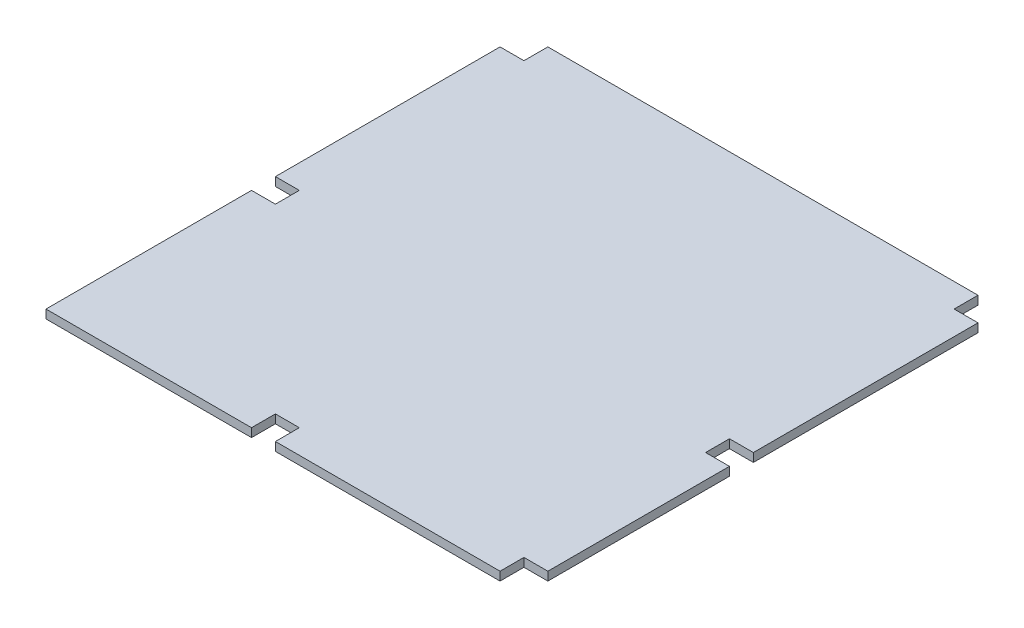
ISO-10303-21;
HEADER;
FILE_DESCRIPTION(('STEP AP214'),'2;1');
FILE_NAME('part.step','',(''),(''),'','','');
FILE_SCHEMA(('AUTOMOTIVE_DESIGN { 1 0 10303 214 1 1 1 1 }'));
ENDSEC;
DATA;
#1=APPLICATION_CONTEXT('core data for automotive mechanical design processes');
#2=APPLICATION_PROTOCOL_DEFINITION('international standard','automotive_design',2000,#1);
#3=PRODUCT_CONTEXT('',#1,'mechanical');
#4=PRODUCT('Part','Part','',(#3));
#5=PRODUCT_RELATED_PRODUCT_CATEGORY('part','',(#4));
#6=PRODUCT_DEFINITION_FORMATION('','',#4);
#7=PRODUCT_DEFINITION_CONTEXT('part definition',#1,'design');
#8=PRODUCT_DEFINITION('design','',#6,#7);
#9=PRODUCT_DEFINITION_SHAPE('','',#8);
#10=(LENGTH_UNIT() NAMED_UNIT(*) SI_UNIT(.MILLI.,.METRE.));
#11=(NAMED_UNIT(*) PLANE_ANGLE_UNIT() SI_UNIT($,.RADIAN.));
#12=(NAMED_UNIT(*) SI_UNIT($,.STERADIAN.) SOLID_ANGLE_UNIT());
#13=UNCERTAINTY_MEASURE_WITH_UNIT(LENGTH_MEASURE(1.E-05),#10,'distance_accuracy_value','');
#14=(GEOMETRIC_REPRESENTATION_CONTEXT(3) GLOBAL_UNCERTAINTY_ASSIGNED_CONTEXT((#13)) GLOBAL_UNIT_ASSIGNED_CONTEXT((#10,
#11,#12)) REPRESENTATION_CONTEXT('',''));
#15=CARTESIAN_POINT('',(0.,0.,0.));
#16=DIRECTION('',(0.,0.,1.));
#17=DIRECTION('',(1.,0.,0.));
#18=AXIS2_PLACEMENT_3D('',#15,#16,#17);
#19=CARTESIAN_POINT('',(0.,18.,180.));
#20=DIRECTION('',(-1.,0.,0.));
#21=DIRECTION('',(0.,0.,1.));
#22=AXIS2_PLACEMENT_3D('',#19,#20,#21);
#23=PLANE('',#22);
#24=DIRECTION('',(0.,0.,-1.));
#25=VECTOR('',#24,1.);
#26=CARTESIAN_POINT('',(0.,0.,180.));
#27=LINE('',#26,#25);
#28=CARTESIAN_POINT('',(0.,0.,180.));
#29=VERTEX_POINT('',#28);
#30=CARTESIAN_POINT('',(0.,0.,-250.));
#31=VERTEX_POINT('',#30);
#32=EDGE_CURVE('E215',#29,#31,#27,.T.);
#33=ORIENTED_EDGE('',*,*,#32,.F.);
#34=DIRECTION('',(0.,-1.,0.));
#35=VECTOR('',#34,1.);
#36=CARTESIAN_POINT('',(0.,18.,180.));
#37=LINE('',#36,#35);
#38=CARTESIAN_POINT('',(0.,18.,180.));
#39=VERTEX_POINT('',#38);
#40=EDGE_CURVE('E11',#39,#29,#37,.T.);
#41=ORIENTED_EDGE('',*,*,#40,.F.);
#42=DIRECTION('',(0.,0.,-1.));
#43=VECTOR('',#42,1.);
#44=CARTESIAN_POINT('',(0.,18.,180.));
#45=LINE('',#44,#43);
#46=CARTESIAN_POINT('',(0.,18.,-250.));
#47=VERTEX_POINT('',#46);
#48=EDGE_CURVE('E271',#39,#47,#45,.T.);
#49=ORIENTED_EDGE('',*,*,#48,.T.);
#50=DIRECTION('',(0.,-1.,0.));
#51=VECTOR('',#50,1.);
#52=CARTESIAN_POINT('',(0.,18.,-250.));
#53=LINE('',#52,#51);
#54=EDGE_CURVE('E35',#47,#31,#53,.T.);
#55=ORIENTED_EDGE('',*,*,#54,.T.);
#56=EDGE_LOOP('',(#33,#41,#49,#55));
#57=FACE_BOUND('',#56,.T.);
#58=ADVANCED_FACE('F32',(#57),#23,.T.);
#59=CARTESIAN_POINT('',(0.,18.,180.));
#60=DIRECTION('',(0.,0.,-1.));
#61=DIRECTION('',(-1.,0.,0.));
#62=AXIS2_PLACEMENT_3D('',#59,#60,#61);
#63=PLANE('',#62);
#64=DIRECTION('',(1.,0.,0.));
#65=VECTOR('',#64,1.);
#66=CARTESIAN_POINT('',(0.,0.,180.));
#67=LINE('',#66,#65);
#68=CARTESIAN_POINT('',(430.,0.,180.));
#69=VERTEX_POINT('',#68);
#70=EDGE_CURVE('E119',#29,#69,#67,.T.);
#71=ORIENTED_EDGE('',*,*,#70,.T.);
#72=DIRECTION('',(0.,-1.,0.));
#73=VECTOR('',#72,1.);
#74=CARTESIAN_POINT('',(430.,18.,180.));
#75=LINE('',#74,#73);
#76=CARTESIAN_POINT('',(430.,18.,180.));
#77=VERTEX_POINT('',#76);
#78=EDGE_CURVE('E41',#77,#69,#75,.T.);
#79=ORIENTED_EDGE('',*,*,#78,.F.);
#80=DIRECTION('',(1.,0.,0.));
#81=VECTOR('',#80,1.);
#82=CARTESIAN_POINT('',(0.,18.,180.));
#83=LINE('',#82,#81);
#84=EDGE_CURVE('E193',#39,#77,#83,.T.);
#85=ORIENTED_EDGE('',*,*,#84,.F.);
#86=ORIENTED_EDGE('',*,*,#40,.T.);
#87=EDGE_LOOP('',(#71,#79,#85,#86));
#88=FACE_BOUND('',#87,.T.);
#89=ADVANCED_FACE('F438',(#88),#63,.F.);
#90=CARTESIAN_POINT('',(430.,18.,180.));
#91=DIRECTION('',(-1.,0.,0.));
#92=DIRECTION('',(0.,0.,1.));
#93=AXIS2_PLACEMENT_3D('',#90,#91,#92);
#94=PLANE('',#93);
#95=DIRECTION('',(0.,0.,-1.));
#96=VECTOR('',#95,1.);
#97=CARTESIAN_POINT('',(430.,0.,180.));
#98=LINE('',#97,#96);
#99=CARTESIAN_POINT('',(430.,0.,130.));
#100=VERTEX_POINT('',#99);
#101=EDGE_CURVE('E200',#69,#100,#98,.T.);
#102=ORIENTED_EDGE('',*,*,#101,.T.);
#103=DIRECTION('',(0.,-1.,0.));
#104=VECTOR('',#103,1.);
#105=CARTESIAN_POINT('',(430.,18.,130.));
#106=LINE('',#105,#104);
#107=CARTESIAN_POINT('',(430.,18.,130.));
#108=VERTEX_POINT('',#107);
#109=EDGE_CURVE('E197',#108,#100,#106,.T.);
#110=ORIENTED_EDGE('',*,*,#109,.F.);
#111=DIRECTION('',(0.,0.,-1.));
#112=VECTOR('',#111,1.);
#113=CARTESIAN_POINT('',(430.,18.,180.));
#114=LINE('',#113,#112);
#115=EDGE_CURVE('E185',#77,#108,#114,.T.);
#116=ORIENTED_EDGE('',*,*,#115,.F.);
#117=ORIENTED_EDGE('',*,*,#78,.T.);
#118=EDGE_LOOP('',(#102,#110,#116,#117));
#119=FACE_BOUND('',#118,.T.);
#120=ADVANCED_FACE('F198',(#119),#94,.F.);
#121=CARTESIAN_POINT('',(430.,18.,130.));
#122=DIRECTION('',(0.,0.,-1.));
#123=DIRECTION('',(-1.,0.,0.));
#124=AXIS2_PLACEMENT_3D('',#121,#122,#123);
#125=PLANE('',#124);
#126=DIRECTION('',(1.,0.,0.));
#127=VECTOR('',#126,1.);
#128=CARTESIAN_POINT('',(430.,0.,130.));
#129=LINE('',#128,#127);
#130=CARTESIAN_POINT('',(480.,0.,130.));
#131=VERTEX_POINT('',#130);
#132=EDGE_CURVE('E268',#100,#131,#129,.T.);
#133=ORIENTED_EDGE('',*,*,#132,.T.);
#134=DIRECTION('',(0.,-1.,0.));
#135=VECTOR('',#134,1.);
#136=CARTESIAN_POINT('',(480.,18.,130.));
#137=LINE('',#136,#135);
#138=CARTESIAN_POINT('',(480.,18.,130.));
#139=VERTEX_POINT('',#138);
#140=EDGE_CURVE('E204',#139,#131,#137,.T.);
#141=ORIENTED_EDGE('',*,*,#140,.F.);
#142=DIRECTION('',(1.,0.,0.));
#143=VECTOR('',#142,1.);
#144=CARTESIAN_POINT('',(430.,18.,130.));
#145=LINE('',#144,#143);
#146=EDGE_CURVE('E191',#108,#139,#145,.T.);
#147=ORIENTED_EDGE('',*,*,#146,.F.);
#148=ORIENTED_EDGE('',*,*,#109,.T.);
#149=EDGE_LOOP('',(#133,#141,#147,#148));
#150=FACE_BOUND('',#149,.T.);
#151=ADVANCED_FACE('F206',(#150),#125,.F.);
#152=CARTESIAN_POINT('',(480.,18.,180.));
#153=DIRECTION('',(-1.,0.,0.));
#154=DIRECTION('',(0.,0.,1.));
#155=AXIS2_PLACEMENT_3D('',#152,#153,#154);
#156=PLANE('',#155);
#157=DIRECTION('',(0.,0.,-1.));
#158=VECTOR('',#157,1.);
#159=CARTESIAN_POINT('',(480.,0.,180.));
#160=LINE('',#159,#158);
#161=CARTESIAN_POINT('',(480.,0.,180.));
#162=VERTEX_POINT('',#161);
#163=EDGE_CURVE('E265',#162,#131,#160,.T.);
#164=ORIENTED_EDGE('',*,*,#163,.F.);
#165=DIRECTION('',(0.,-1.,0.));
#166=VECTOR('',#165,1.);
#167=CARTESIAN_POINT('',(480.,18.,180.));
#168=LINE('',#167,#166);
#169=CARTESIAN_POINT('',(480.,18.,180.));
#170=VERTEX_POINT('',#169);
#171=EDGE_CURVE('E275',#170,#162,#168,.T.);
#172=ORIENTED_EDGE('',*,*,#171,.F.);
#173=DIRECTION('',(0.,0.,-1.));
#174=VECTOR('',#173,1.);
#175=CARTESIAN_POINT('',(480.,18.,180.));
#176=LINE('',#175,#174);
#177=EDGE_CURVE('E208',#170,#139,#176,.T.);
#178=ORIENTED_EDGE('',*,*,#177,.T.);
#179=ORIENTED_EDGE('',*,*,#140,.T.);
#180=EDGE_LOOP('',(#164,#172,#178,#179));
#181=FACE_BOUND('',#180,.T.);
#182=ADVANCED_FACE('F319',(#181),#156,.T.);
#183=CARTESIAN_POINT('',(480.,18.,180.));
#184=DIRECTION('',(0.,0.,-1.));
#185=DIRECTION('',(-1.,0.,0.));
#186=AXIS2_PLACEMENT_3D('',#183,#184,#185);
#187=PLANE('',#186);
#188=DIRECTION('',(1.,0.,0.));
#189=VECTOR('',#188,1.);
#190=CARTESIAN_POINT('',(480.,0.,180.));
#191=LINE('',#190,#189);
#192=CARTESIAN_POINT('',(950.,0.,180.));
#193=VERTEX_POINT('',#192);
#194=EDGE_CURVE('E263',#162,#193,#191,.T.);
#195=ORIENTED_EDGE('',*,*,#194,.T.);
#196=DIRECTION('',(0.,-1.,0.));
#197=VECTOR('',#196,1.);
#198=CARTESIAN_POINT('',(950.,18.,180.));
#199=LINE('',#198,#197);
#200=CARTESIAN_POINT('',(950.,18.,180.));
#201=VERTEX_POINT('',#200);
#202=EDGE_CURVE('E277',#201,#193,#199,.T.);
#203=ORIENTED_EDGE('',*,*,#202,.F.);
#204=DIRECTION('',(1.,0.,0.));
#205=VECTOR('',#204,1.);
#206=CARTESIAN_POINT('',(480.,18.,180.));
#207=LINE('',#206,#205);
#208=EDGE_CURVE('E210',#170,#201,#207,.T.);
#209=ORIENTED_EDGE('',*,*,#208,.F.);
#210=ORIENTED_EDGE('',*,*,#171,.T.);
#211=EDGE_LOOP('',(#195,#203,#209,#210));
#212=FACE_BOUND('',#211,.T.);
#213=ADVANCED_FACE('F327',(#212),#187,.F.);
#214=CARTESIAN_POINT('',(950.,18.,180.));
#215=DIRECTION('',(-1.,0.,0.));
#216=DIRECTION('',(0.,0.,1.));
#217=AXIS2_PLACEMENT_3D('',#214,#215,#216);
#218=PLANE('',#217);
#219=DIRECTION('',(0.,0.,-1.));
#220=VECTOR('',#219,1.);
#221=CARTESIAN_POINT('',(950.,0.,180.));
#222=LINE('',#221,#220);
#223=CARTESIAN_POINT('',(950.,0.,130.));
#224=VERTEX_POINT('',#223);
#225=EDGE_CURVE('E260',#193,#224,#222,.T.);
#226=ORIENTED_EDGE('',*,*,#225,.T.);
#227=DIRECTION('',(0.,-1.,0.));
#228=VECTOR('',#227,1.);
#229=CARTESIAN_POINT('',(950.,18.,130.));
#230=LINE('',#229,#228);
#231=CARTESIAN_POINT('',(950.,18.,130.));
#232=VERTEX_POINT('',#231);
#233=EDGE_CURVE('E280',#232,#224,#230,.T.);
#234=ORIENTED_EDGE('',*,*,#233,.F.);
#235=DIRECTION('',(0.,0.,-1.));
#236=VECTOR('',#235,1.);
#237=CARTESIAN_POINT('',(950.,18.,180.));
#238=LINE('',#237,#236);
#239=EDGE_CURVE('E324',#201,#232,#238,.T.);
#240=ORIENTED_EDGE('',*,*,#239,.F.);
#241=ORIENTED_EDGE('',*,*,#202,.T.);
#242=EDGE_LOOP('',(#226,#234,#240,#241));
#243=FACE_BOUND('',#242,.T.);
#244=ADVANCED_FACE('F329',(#243),#218,.F.);
#245=CARTESIAN_POINT('',(1000.,18.,130.));
#246=DIRECTION('',(0.,0.,1.));
#247=DIRECTION('',(1.,0.,0.));
#248=AXIS2_PLACEMENT_3D('',#245,#246,#247);
#249=PLANE('',#248);
#250=DIRECTION('',(-1.,0.,0.));
#251=VECTOR('',#250,1.);
#252=CARTESIAN_POINT('',(1000.,0.,130.));
#253=LINE('',#252,#251);
#254=CARTESIAN_POINT('',(1000.,0.,130.));
#255=VERTEX_POINT('',#254);
#256=EDGE_CURVE('E257',#255,#224,#253,.T.);
#257=ORIENTED_EDGE('',*,*,#256,.F.);
#258=DIRECTION('',(0.,-1.,0.));
#259=VECTOR('',#258,1.);
#260=CARTESIAN_POINT('',(1000.,18.,130.));
#261=LINE('',#260,#259);
#262=CARTESIAN_POINT('',(1000.,18.,130.));
#263=VERTEX_POINT('',#262);
#264=EDGE_CURVE('E282',#263,#255,#261,.T.);
#265=ORIENTED_EDGE('',*,*,#264,.F.);
#266=DIRECTION('',(-1.,0.,0.));
#267=VECTOR('',#266,1.);
#268=CARTESIAN_POINT('',(1000.,18.,130.));
#269=LINE('',#268,#267);
#270=EDGE_CURVE('E331',#263,#232,#269,.T.);
#271=ORIENTED_EDGE('',*,*,#270,.T.);
#272=ORIENTED_EDGE('',*,*,#233,.T.);
#273=EDGE_LOOP('',(#257,#265,#271,#272));
#274=FACE_BOUND('',#273,.T.);
#275=ADVANCED_FACE('F427',(#274),#249,.T.);
#276=CARTESIAN_POINT('',(1000.,18.,130.));
#277=DIRECTION('',(-1.,0.,0.));
#278=DIRECTION('',(0.,0.,1.));
#279=AXIS2_PLACEMENT_3D('',#276,#277,#278);
#280=PLANE('',#279);
#281=DIRECTION('',(0.,0.,-1.));
#282=VECTOR('',#281,1.);
#283=CARTESIAN_POINT('',(1000.,0.,130.));
#284=LINE('',#283,#282);
#285=CARTESIAN_POINT('',(1000.,0.,-250.));
#286=VERTEX_POINT('',#285);
#287=EDGE_CURVE('E255',#255,#286,#284,.T.);
#288=ORIENTED_EDGE('',*,*,#287,.T.);
#289=DIRECTION('',(0.,-1.,0.));
#290=VECTOR('',#289,1.);
#291=CARTESIAN_POINT('',(1000.,18.,-250.));
#292=LINE('',#291,#290);
#293=CARTESIAN_POINT('',(1000.,18.,-250.));
#294=VERTEX_POINT('',#293);
#295=EDGE_CURVE('E284',#294,#286,#292,.T.);
#296=ORIENTED_EDGE('',*,*,#295,.F.);
#297=DIRECTION('',(0.,0.,-1.));
#298=VECTOR('',#297,1.);
#299=CARTESIAN_POINT('',(1000.,18.,130.));
#300=LINE('',#299,#298);
#301=EDGE_CURVE('E333',#263,#294,#300,.T.);
#302=ORIENTED_EDGE('',*,*,#301,.F.);
#303=ORIENTED_EDGE('',*,*,#264,.T.);
#304=EDGE_LOOP('',(#288,#296,#302,#303));
#305=FACE_BOUND('',#304,.T.);
#306=ADVANCED_FACE('F424',(#305),#280,.F.);
#307=CARTESIAN_POINT('',(1000.,18.,-250.));
#308=DIRECTION('',(0.,0.,1.));
#309=DIRECTION('',(1.,0.,0.));
#310=AXIS2_PLACEMENT_3D('',#307,#308,#309);
#311=PLANE('',#310);
#312=DIRECTION('',(-1.,0.,0.));
#313=VECTOR('',#312,1.);
#314=CARTESIAN_POINT('',(1000.,0.,-250.));
#315=LINE('',#314,#313);
#316=CARTESIAN_POINT('',(950.,0.,-250.));
#317=VERTEX_POINT('',#316);
#318=EDGE_CURVE('E253',#286,#317,#315,.T.);
#319=ORIENTED_EDGE('',*,*,#318,.T.);
#320=DIRECTION('',(0.,-1.,0.));
#321=VECTOR('',#320,1.);
#322=CARTESIAN_POINT('',(950.,18.,-250.));
#323=LINE('',#322,#321);
#324=CARTESIAN_POINT('',(950.,18.,-250.));
#325=VERTEX_POINT('',#324);
#326=EDGE_CURVE('E287',#325,#317,#323,.T.);
#327=ORIENTED_EDGE('',*,*,#326,.F.);
#328=DIRECTION('',(-1.,0.,0.));
#329=VECTOR('',#328,1.);
#330=CARTESIAN_POINT('',(1000.,18.,-250.));
#331=LINE('',#330,#329);
#332=EDGE_CURVE('E337',#294,#325,#331,.T.);
#333=ORIENTED_EDGE('',*,*,#332,.F.);
#334=ORIENTED_EDGE('',*,*,#295,.T.);
#335=EDGE_LOOP('',(#319,#327,#333,#334));
#336=FACE_BOUND('',#335,.T.);
#337=ADVANCED_FACE('F420',(#336),#311,.F.);
#338=CARTESIAN_POINT('',(950.,18.,-250.));
#339=DIRECTION('',(-1.,0.,0.));
#340=DIRECTION('',(0.,0.,1.));
#341=AXIS2_PLACEMENT_3D('',#338,#339,#340);
#342=PLANE('',#341);
#343=DIRECTION('',(0.,0.,-1.));
#344=VECTOR('',#343,1.);
#345=CARTESIAN_POINT('',(950.,0.,-250.));
#346=LINE('',#345,#344);
#347=CARTESIAN_POINT('',(950.,0.,-300.));
#348=VERTEX_POINT('',#347);
#349=EDGE_CURVE('E250',#317,#348,#346,.T.);
#350=ORIENTED_EDGE('',*,*,#349,.T.);
#351=DIRECTION('',(0.,-1.,0.));
#352=VECTOR('',#351,1.);
#353=CARTESIAN_POINT('',(950.,18.,-300.));
#354=LINE('',#353,#352);
#355=CARTESIAN_POINT('',(950.,18.,-300.));
#356=VERTEX_POINT('',#355);
#357=EDGE_CURVE('E290',#356,#348,#354,.T.);
#358=ORIENTED_EDGE('',*,*,#357,.F.);
#359=DIRECTION('',(0.,0.,-1.));
#360=VECTOR('',#359,1.);
#361=CARTESIAN_POINT('',(950.,18.,-250.));
#362=LINE('',#361,#360);
#363=EDGE_CURVE('E339',#325,#356,#362,.T.);
#364=ORIENTED_EDGE('',*,*,#363,.F.);
#365=ORIENTED_EDGE('',*,*,#326,.T.);
#366=EDGE_LOOP('',(#350,#358,#364,#365));
#367=FACE_BOUND('',#366,.T.);
#368=ADVANCED_FACE('F415',(#367),#342,.F.);
#369=CARTESIAN_POINT('',(1000.,18.,-300.));
#370=DIRECTION('',(0.,0.,1.));
#371=DIRECTION('',(1.,0.,0.));
#372=AXIS2_PLACEMENT_3D('',#369,#370,#371);
#373=PLANE('',#372);
#374=DIRECTION('',(-1.,0.,0.));
#375=VECTOR('',#374,1.);
#376=CARTESIAN_POINT('',(1000.,0.,-300.));
#377=LINE('',#376,#375);
#378=CARTESIAN_POINT('',(1000.,0.,-300.));
#379=VERTEX_POINT('',#378);
#380=EDGE_CURVE('E247',#379,#348,#377,.T.);
#381=ORIENTED_EDGE('',*,*,#380,.F.);
#382=DIRECTION('',(0.,-1.,0.));
#383=VECTOR('',#382,1.);
#384=CARTESIAN_POINT('',(1000.,18.,-300.));
#385=LINE('',#384,#383);
#386=CARTESIAN_POINT('',(1000.,18.,-300.));
#387=VERTEX_POINT('',#386);
#388=EDGE_CURVE('E292',#387,#379,#385,.T.);
#389=ORIENTED_EDGE('',*,*,#388,.F.);
#390=DIRECTION('',(-1.,0.,0.));
#391=VECTOR('',#390,1.);
#392=CARTESIAN_POINT('',(1000.,18.,-300.));
#393=LINE('',#392,#391);
#394=EDGE_CURVE('E341',#387,#356,#393,.T.);
#395=ORIENTED_EDGE('',*,*,#394,.T.);
#396=ORIENTED_EDGE('',*,*,#357,.T.);
#397=EDGE_LOOP('',(#381,#389,#395,#396));
#398=FACE_BOUND('',#397,.T.);
#399=ADVANCED_FACE('F409',(#398),#373,.T.);
#400=CARTESIAN_POINT('',(1000.,18.,-300.));
#401=DIRECTION('',(-1.,0.,0.));
#402=DIRECTION('',(0.,0.,1.));
#403=AXIS2_PLACEMENT_3D('',#400,#401,#402);
#404=PLANE('',#403);
#405=DIRECTION('',(0.,0.,-1.));
#406=VECTOR('',#405,1.);
#407=CARTESIAN_POINT('',(1000.,0.,-300.));
#408=LINE('',#407,#406);
#409=CARTESIAN_POINT('',(1000.,0.,-770.));
#410=VERTEX_POINT('',#409);
#411=EDGE_CURVE('E245',#379,#410,#408,.T.);
#412=ORIENTED_EDGE('',*,*,#411,.T.);
#413=DIRECTION('',(0.,-1.,0.));
#414=VECTOR('',#413,1.);
#415=CARTESIAN_POINT('',(1000.,18.,-770.));
#416=LINE('',#415,#414);
#417=CARTESIAN_POINT('',(1000.,18.,-770.));
#418=VERTEX_POINT('',#417);
#419=EDGE_CURVE('E294',#418,#410,#416,.T.);
#420=ORIENTED_EDGE('',*,*,#419,.F.);
#421=DIRECTION('',(0.,0.,-1.));
#422=VECTOR('',#421,1.);
#423=CARTESIAN_POINT('',(1000.,18.,-300.));
#424=LINE('',#423,#422);
#425=EDGE_CURVE('E344',#387,#418,#424,.T.);
#426=ORIENTED_EDGE('',*,*,#425,.F.);
#427=ORIENTED_EDGE('',*,*,#388,.T.);
#428=EDGE_LOOP('',(#412,#420,#426,#427));
#429=FACE_BOUND('',#428,.T.);
#430=ADVANCED_FACE('F406',(#429),#404,.F.);
#431=CARTESIAN_POINT('',(1000.,18.,-770.));
#432=DIRECTION('',(0.,0.,1.));
#433=DIRECTION('',(1.,0.,0.));
#434=AXIS2_PLACEMENT_3D('',#431,#432,#433);
#435=PLANE('',#434);
#436=DIRECTION('',(-1.,0.,0.));
#437=VECTOR('',#436,1.);
#438=CARTESIAN_POINT('',(1000.,0.,-770.));
#439=LINE('',#438,#437);
#440=CARTESIAN_POINT('',(950.,0.,-770.));
#441=VERTEX_POINT('',#440);
#442=EDGE_CURVE('E242',#410,#441,#439,.T.);
#443=ORIENTED_EDGE('',*,*,#442,.T.);
#444=DIRECTION('',(0.,-1.,0.));
#445=VECTOR('',#444,1.);
#446=CARTESIAN_POINT('',(950.,18.,-770.));
#447=LINE('',#446,#445);
#448=CARTESIAN_POINT('',(950.,18.,-770.));
#449=VERTEX_POINT('',#448);
#450=EDGE_CURVE('E297',#449,#441,#447,.T.);
#451=ORIENTED_EDGE('',*,*,#450,.F.);
#452=DIRECTION('',(-1.,0.,0.));
#453=VECTOR('',#452,1.);
#454=CARTESIAN_POINT('',(1000.,18.,-770.));
#455=LINE('',#454,#453);
#456=EDGE_CURVE('E346',#418,#449,#455,.T.);
#457=ORIENTED_EDGE('',*,*,#456,.F.);
#458=ORIENTED_EDGE('',*,*,#419,.T.);
#459=EDGE_LOOP('',(#443,#451,#457,#458));
#460=FACE_BOUND('',#459,.T.);
#461=ADVANCED_FACE('F401',(#460),#435,.F.);
#462=CARTESIAN_POINT('',(950.,18.,-820.));
#463=DIRECTION('',(1.,0.,0.));
#464=DIRECTION('',(0.,0.,-1.));
#465=AXIS2_PLACEMENT_3D('',#462,#463,#464);
#466=PLANE('',#465);
#467=DIRECTION('',(0.,0.,1.));
#468=VECTOR('',#467,1.);
#469=CARTESIAN_POINT('',(950.,0.,-820.));
#470=LINE('',#469,#468);
#471=CARTESIAN_POINT('',(950.,0.,-820.));
#472=VERTEX_POINT('',#471);
#473=EDGE_CURVE('E239',#472,#441,#470,.T.);
#474=ORIENTED_EDGE('',*,*,#473,.F.);
#475=DIRECTION('',(0.,-1.,0.));
#476=VECTOR('',#475,1.);
#477=CARTESIAN_POINT('',(950.,18.,-820.));
#478=LINE('',#477,#476);
#479=CARTESIAN_POINT('',(950.,18.,-820.));
#480=VERTEX_POINT('',#479);
#481=EDGE_CURVE('E299',#480,#472,#478,.T.);
#482=ORIENTED_EDGE('',*,*,#481,.F.);
#483=DIRECTION('',(0.,0.,1.));
#484=VECTOR('',#483,1.);
#485=CARTESIAN_POINT('',(950.,18.,-820.));
#486=LINE('',#485,#484);
#487=EDGE_CURVE('E348',#480,#449,#486,.T.);
#488=ORIENTED_EDGE('',*,*,#487,.T.);
#489=ORIENTED_EDGE('',*,*,#450,.T.);
#490=EDGE_LOOP('',(#474,#482,#488,#489));
#491=FACE_BOUND('',#490,.T.);
#492=ADVANCED_FACE('F395',(#491),#466,.T.);
#493=CARTESIAN_POINT('',(50.,18.,-820.));
#494=DIRECTION('',(0.,0.,-1.));
#495=DIRECTION('',(-1.,0.,0.));
#496=AXIS2_PLACEMENT_3D('',#493,#494,#495);
#497=PLANE('',#496);
#498=DIRECTION('',(1.,0.,0.));
#499=VECTOR('',#498,1.);
#500=CARTESIAN_POINT('',(50.,0.,-820.));
#501=LINE('',#500,#499);
#502=CARTESIAN_POINT('',(50.,0.,-820.));
#503=VERTEX_POINT('',#502);
#504=EDGE_CURVE('E236',#503,#472,#501,.T.);
#505=ORIENTED_EDGE('',*,*,#504,.F.);
#506=DIRECTION('',(0.,-1.,0.));
#507=VECTOR('',#506,1.);
#508=CARTESIAN_POINT('',(50.,18.,-820.));
#509=LINE('',#508,#507);
#510=CARTESIAN_POINT('',(50.,18.,-820.));
#511=VERTEX_POINT('',#510);
#512=EDGE_CURVE('E301',#511,#503,#509,.T.);
#513=ORIENTED_EDGE('',*,*,#512,.F.);
#514=DIRECTION('',(1.,0.,0.));
#515=VECTOR('',#514,1.);
#516=CARTESIAN_POINT('',(50.,18.,-820.));
#517=LINE('',#516,#515);
#518=EDGE_CURVE('E351',#511,#480,#517,.T.);
#519=ORIENTED_EDGE('',*,*,#518,.T.);
#520=ORIENTED_EDGE('',*,*,#481,.T.);
#521=EDGE_LOOP('',(#505,#513,#519,#520));
#522=FACE_BOUND('',#521,.T.);
#523=ADVANCED_FACE('F389',(#522),#497,.T.);
#524=CARTESIAN_POINT('',(50.,18.,-820.));
#525=DIRECTION('',(1.,0.,0.));
#526=DIRECTION('',(0.,0.,-1.));
#527=AXIS2_PLACEMENT_3D('',#524,#525,#526);
#528=PLANE('',#527);
#529=DIRECTION('',(0.,0.,1.));
#530=VECTOR('',#529,1.);
#531=CARTESIAN_POINT('',(50.,0.,-820.));
#532=LINE('',#531,#530);
#533=CARTESIAN_POINT('',(50.,0.,-770.));
#534=VERTEX_POINT('',#533);
#535=EDGE_CURVE('E233',#503,#534,#532,.T.);
#536=ORIENTED_EDGE('',*,*,#535,.T.);
#537=DIRECTION('',(0.,-1.,0.));
#538=VECTOR('',#537,1.);
#539=CARTESIAN_POINT('',(50.,18.,-770.));
#540=LINE('',#539,#538);
#541=CARTESIAN_POINT('',(50.,18.,-770.));
#542=VERTEX_POINT('',#541);
#543=EDGE_CURVE('E303',#542,#534,#540,.T.);
#544=ORIENTED_EDGE('',*,*,#543,.F.);
#545=DIRECTION('',(0.,0.,1.));
#546=VECTOR('',#545,1.);
#547=CARTESIAN_POINT('',(50.,18.,-820.));
#548=LINE('',#547,#546);
#549=EDGE_CURVE('E354',#511,#542,#548,.T.);
#550=ORIENTED_EDGE('',*,*,#549,.F.);
#551=ORIENTED_EDGE('',*,*,#512,.T.);
#552=EDGE_LOOP('',(#536,#544,#550,#551));
#553=FACE_BOUND('',#552,.T.);
#554=ADVANCED_FACE('F428',(#553),#528,.F.);
#555=CARTESIAN_POINT('',(0.,18.,-770.));
#556=DIRECTION('',(0.,0.,-1.));
#557=DIRECTION('',(-1.,0.,0.));
#558=AXIS2_PLACEMENT_3D('',#555,#556,#557);
#559=PLANE('',#558);
#560=DIRECTION('',(1.,0.,0.));
#561=VECTOR('',#560,1.);
#562=CARTESIAN_POINT('',(0.,0.,-770.));
#563=LINE('',#562,#561);
#564=CARTESIAN_POINT('',(0.,0.,-770.));
#565=VERTEX_POINT('',#564);
#566=EDGE_CURVE('E230',#565,#534,#563,.T.);
#567=ORIENTED_EDGE('',*,*,#566,.F.);
#568=DIRECTION('',(0.,-1.,0.));
#569=VECTOR('',#568,1.);
#570=CARTESIAN_POINT('',(0.,18.,-770.));
#571=LINE('',#570,#569);
#572=CARTESIAN_POINT('',(0.,18.,-770.));
#573=VERTEX_POINT('',#572);
#574=EDGE_CURVE('E305',#573,#565,#571,.T.);
#575=ORIENTED_EDGE('',*,*,#574,.F.);
#576=DIRECTION('',(1.,0.,0.));
#577=VECTOR('',#576,1.);
#578=CARTESIAN_POINT('',(0.,18.,-770.));
#579=LINE('',#578,#577);
#580=EDGE_CURVE('E356',#573,#542,#579,.T.);
#581=ORIENTED_EDGE('',*,*,#580,.T.);
#582=ORIENTED_EDGE('',*,*,#543,.T.);
#583=EDGE_LOOP('',(#567,#575,#581,#582));
#584=FACE_BOUND('',#583,.T.);
#585=ADVANCED_FACE('F383',(#584),#559,.T.);
#586=CARTESIAN_POINT('',(0.,18.,-300.));
#587=DIRECTION('',(-1.,0.,0.));
#588=DIRECTION('',(0.,0.,1.));
#589=AXIS2_PLACEMENT_3D('',#586,#587,#588);
#590=PLANE('',#589);
#591=DIRECTION('',(0.,0.,-1.));
#592=VECTOR('',#591,1.);
#593=CARTESIAN_POINT('',(0.,0.,-300.));
#594=LINE('',#593,#592);
#595=CARTESIAN_POINT('',(0.,0.,-300.));
#596=VERTEX_POINT('',#595);
#597=EDGE_CURVE('E227',#596,#565,#594,.T.);
#598=ORIENTED_EDGE('',*,*,#597,.F.);
#599=DIRECTION('',(0.,-1.,0.));
#600=VECTOR('',#599,1.);
#601=CARTESIAN_POINT('',(0.,18.,-300.));
#602=LINE('',#601,#600);
#603=CARTESIAN_POINT('',(0.,18.,-300.));
#604=VERTEX_POINT('',#603);
#605=EDGE_CURVE('E307',#604,#596,#602,.T.);
#606=ORIENTED_EDGE('',*,*,#605,.F.);
#607=DIRECTION('',(0.,0.,-1.));
#608=VECTOR('',#607,1.);
#609=CARTESIAN_POINT('',(0.,18.,-300.));
#610=LINE('',#609,#608);
#611=EDGE_CURVE('E359',#604,#573,#610,.T.);
#612=ORIENTED_EDGE('',*,*,#611,.T.);
#613=ORIENTED_EDGE('',*,*,#574,.T.);
#614=EDGE_LOOP('',(#598,#606,#612,#613));
#615=FACE_BOUND('',#614,.T.);
#616=ADVANCED_FACE('F379',(#615),#590,.T.);
#617=CARTESIAN_POINT('',(0.,18.,-300.));
#618=DIRECTION('',(0.,0.,-1.));
#619=DIRECTION('',(-1.,0.,0.));
#620=AXIS2_PLACEMENT_3D('',#617,#618,#619);
#621=PLANE('',#620);
#622=DIRECTION('',(1.,0.,0.));
#623=VECTOR('',#622,1.);
#624=CARTESIAN_POINT('',(0.,0.,-300.));
#625=LINE('',#624,#623);
#626=CARTESIAN_POINT('',(50.,0.,-300.));
#627=VERTEX_POINT('',#626);
#628=EDGE_CURVE('E224',#596,#627,#625,.T.);
#629=ORIENTED_EDGE('',*,*,#628,.T.);
#630=DIRECTION('',(0.,-1.,0.));
#631=VECTOR('',#630,1.);
#632=CARTESIAN_POINT('',(50.,18.,-300.));
#633=LINE('',#632,#631);
#634=CARTESIAN_POINT('',(50.,18.,-300.));
#635=VERTEX_POINT('',#634);
#636=EDGE_CURVE('E309',#635,#627,#633,.T.);
#637=ORIENTED_EDGE('',*,*,#636,.F.);
#638=DIRECTION('',(1.,0.,0.));
#639=VECTOR('',#638,1.);
#640=CARTESIAN_POINT('',(0.,18.,-300.));
#641=LINE('',#640,#639);
#642=EDGE_CURVE('E362',#604,#635,#641,.T.);
#643=ORIENTED_EDGE('',*,*,#642,.F.);
#644=ORIENTED_EDGE('',*,*,#605,.T.);
#645=EDGE_LOOP('',(#629,#637,#643,#644));
#646=FACE_BOUND('',#645,.T.);
#647=ADVANCED_FACE('F500',(#646),#621,.F.);
#648=CARTESIAN_POINT('',(50.,18.,-250.));
#649=DIRECTION('',(-1.,0.,0.));
#650=DIRECTION('',(0.,0.,1.));
#651=AXIS2_PLACEMENT_3D('',#648,#649,#650);
#652=PLANE('',#651);
#653=DIRECTION('',(0.,0.,-1.));
#654=VECTOR('',#653,1.);
#655=CARTESIAN_POINT('',(50.,0.,-250.));
#656=LINE('',#655,#654);
#657=CARTESIAN_POINT('',(50.,0.,-250.));
#658=VERTEX_POINT('',#657);
#659=EDGE_CURVE('E221',#658,#627,#656,.T.);
#660=ORIENTED_EDGE('',*,*,#659,.F.);
#661=DIRECTION('',(0.,-1.,0.));
#662=VECTOR('',#661,1.);
#663=CARTESIAN_POINT('',(50.,18.,-250.));
#664=LINE('',#663,#662);
#665=CARTESIAN_POINT('',(50.,18.,-250.));
#666=VERTEX_POINT('',#665);
#667=EDGE_CURVE('E310',#666,#658,#664,.T.);
#668=ORIENTED_EDGE('',*,*,#667,.F.);
#669=DIRECTION('',(0.,0.,-1.));
#670=VECTOR('',#669,1.);
#671=CARTESIAN_POINT('',(50.,18.,-250.));
#672=LINE('',#671,#670);
#673=EDGE_CURVE('E364',#666,#635,#672,.T.);
#674=ORIENTED_EDGE('',*,*,#673,.T.);
#675=ORIENTED_EDGE('',*,*,#636,.T.);
#676=EDGE_LOOP('',(#660,#668,#674,#675));
#677=FACE_BOUND('',#676,.T.);
#678=ADVANCED_FACE('F374',(#677),#652,.T.);
#679=CARTESIAN_POINT('',(0.,18.,-250.));
#680=DIRECTION('',(0.,0.,-1.));
#681=DIRECTION('',(-1.,0.,0.));
#682=AXIS2_PLACEMENT_3D('',#679,#680,#681);
#683=PLANE('',#682);
#684=DIRECTION('',(1.,0.,0.));
#685=VECTOR('',#684,1.);
#686=CARTESIAN_POINT('',(0.,0.,-250.));
#687=LINE('',#686,#685);
#688=EDGE_CURVE('E218',#31,#658,#687,.T.);
#689=ORIENTED_EDGE('',*,*,#688,.F.);
#690=ORIENTED_EDGE('',*,*,#54,.F.);
#691=DIRECTION('',(1.,0.,0.));
#692=VECTOR('',#691,1.);
#693=CARTESIAN_POINT('',(0.,18.,-250.));
#694=LINE('',#693,#692);
#695=EDGE_CURVE('E367',#47,#666,#694,.T.);
#696=ORIENTED_EDGE('',*,*,#695,.T.);
#697=ORIENTED_EDGE('',*,*,#667,.T.);
#698=EDGE_LOOP('',(#689,#690,#696,#697));
#699=FACE_BOUND('',#698,.T.);
#700=ADVANCED_FACE('F312',(#699),#683,.T.);
#701=CARTESIAN_POINT('',(0.,18.,0.));
#702=DIRECTION('',(0.,-1.,0.));
#703=DIRECTION('',(0.,0.,-1.));
#704=AXIS2_PLACEMENT_3D('',#701,#702,#703);
#705=PLANE('',#704);
#706=ORIENTED_EDGE('',*,*,#48,.F.);
#707=ORIENTED_EDGE('',*,*,#84,.T.);
#708=ORIENTED_EDGE('',*,*,#115,.T.);
#709=ORIENTED_EDGE('',*,*,#146,.T.);
#710=ORIENTED_EDGE('',*,*,#177,.F.);
#711=ORIENTED_EDGE('',*,*,#208,.T.);
#712=ORIENTED_EDGE('',*,*,#239,.T.);
#713=ORIENTED_EDGE('',*,*,#270,.F.);
#714=ORIENTED_EDGE('',*,*,#301,.T.);
#715=ORIENTED_EDGE('',*,*,#332,.T.);
#716=ORIENTED_EDGE('',*,*,#363,.T.);
#717=ORIENTED_EDGE('',*,*,#394,.F.);
#718=ORIENTED_EDGE('',*,*,#425,.T.);
#719=ORIENTED_EDGE('',*,*,#456,.T.);
#720=ORIENTED_EDGE('',*,*,#487,.F.);
#721=ORIENTED_EDGE('',*,*,#518,.F.);
#722=ORIENTED_EDGE('',*,*,#549,.T.);
#723=ORIENTED_EDGE('',*,*,#580,.F.);
#724=ORIENTED_EDGE('',*,*,#611,.F.);
#725=ORIENTED_EDGE('',*,*,#642,.T.);
#726=ORIENTED_EDGE('',*,*,#673,.F.);
#727=ORIENTED_EDGE('',*,*,#695,.F.);
#728=EDGE_LOOP('',(#706,#707,#708,#709,#710,#711,#712,#713,#714,#715,#716,#717,#718,#719,#720,
#721,#722,#723,#724,#725,#726,#727));
#729=FACE_BOUND('',#728,.T.);
#730=ADVANCED_FACE('F188',(#729),#705,.F.);
#731=CARTESIAN_POINT('',(0.,0.,0.));
#732=DIRECTION('',(0.,-1.,0.));
#733=DIRECTION('',(0.,0.,-1.));
#734=AXIS2_PLACEMENT_3D('',#731,#732,#733);
#735=PLANE('',#734);
#736=ORIENTED_EDGE('',*,*,#32,.T.);
#737=ORIENTED_EDGE('',*,*,#688,.T.);
#738=ORIENTED_EDGE('',*,*,#659,.T.);
#739=ORIENTED_EDGE('',*,*,#628,.F.);
#740=ORIENTED_EDGE('',*,*,#597,.T.);
#741=ORIENTED_EDGE('',*,*,#566,.T.);
#742=ORIENTED_EDGE('',*,*,#535,.F.);
#743=ORIENTED_EDGE('',*,*,#504,.T.);
#744=ORIENTED_EDGE('',*,*,#473,.T.);
#745=ORIENTED_EDGE('',*,*,#442,.F.);
#746=ORIENTED_EDGE('',*,*,#411,.F.);
#747=ORIENTED_EDGE('',*,*,#380,.T.);
#748=ORIENTED_EDGE('',*,*,#349,.F.);
#749=ORIENTED_EDGE('',*,*,#318,.F.);
#750=ORIENTED_EDGE('',*,*,#287,.F.);
#751=ORIENTED_EDGE('',*,*,#256,.T.);
#752=ORIENTED_EDGE('',*,*,#225,.F.);
#753=ORIENTED_EDGE('',*,*,#194,.F.);
#754=ORIENTED_EDGE('',*,*,#163,.T.);
#755=ORIENTED_EDGE('',*,*,#132,.F.);
#756=ORIENTED_EDGE('',*,*,#101,.F.);
#757=ORIENTED_EDGE('',*,*,#70,.F.);
#758=EDGE_LOOP('',(#736,#737,#738,#739,#740,#741,#742,#743,#744,#745,#746,#747,#748,#749,#750,
#751,#752,#753,#754,#755,#756,#757));
#759=FACE_BOUND('',#758,.T.);
#760=ADVANCED_FACE('F314',(#759),#735,.T.);
#761=CLOSED_SHELL('',(#58,#89,#120,#151,#182,#213,#244,#275,#306,#337,#368,#399,#430,#461,#492,
#523,#554,#585,#616,#647,#678,#700,#730,#760));
#762=MANIFOLD_SOLID_BREP('B2',#761);
#763=ADVANCED_BREP_SHAPE_REPRESENTATION('',(#18,#762),#14);
#764=SHAPE_DEFINITION_REPRESENTATION(#9,#763);
ENDSEC;
END-ISO-10303-21;
